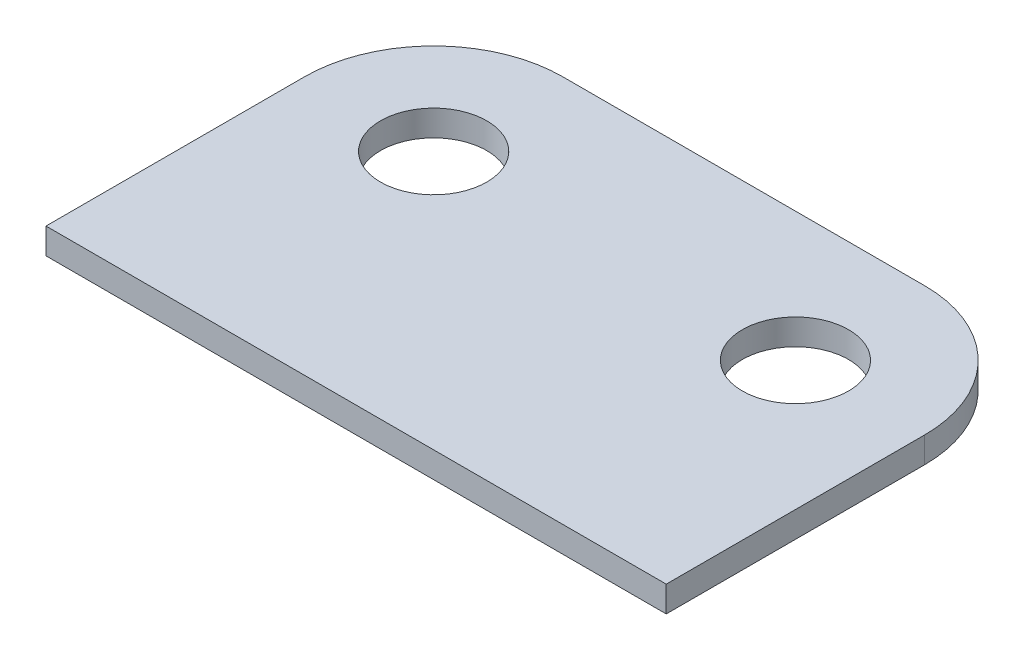
ISO-10303-21;
HEADER;
FILE_DESCRIPTION(('STEP AP214'),'2;1');
FILE_NAME('part.step','',(''),(''),'','','');
FILE_SCHEMA(('AUTOMOTIVE_DESIGN { 1 0 10303 214 1 1 1 1 }'));
ENDSEC;
DATA;
#1=APPLICATION_CONTEXT('core data for automotive mechanical design processes');
#2=APPLICATION_PROTOCOL_DEFINITION('international standard','automotive_design',2000,#1);
#3=PRODUCT_CONTEXT('',#1,'mechanical');
#4=PRODUCT('Part','Part','',(#3));
#5=PRODUCT_RELATED_PRODUCT_CATEGORY('part','',(#4));
#6=PRODUCT_DEFINITION_FORMATION('','',#4);
#7=PRODUCT_DEFINITION_CONTEXT('part definition',#1,'design');
#8=PRODUCT_DEFINITION('design','',#6,#7);
#9=PRODUCT_DEFINITION_SHAPE('','',#8);
#10=(LENGTH_UNIT() NAMED_UNIT(*) SI_UNIT(.MILLI.,.METRE.));
#11=(NAMED_UNIT(*) PLANE_ANGLE_UNIT() SI_UNIT($,.RADIAN.));
#12=(NAMED_UNIT(*) SI_UNIT($,.STERADIAN.) SOLID_ANGLE_UNIT());
#13=UNCERTAINTY_MEASURE_WITH_UNIT(LENGTH_MEASURE(1.E-05),#10,'distance_accuracy_value','');
#14=(GEOMETRIC_REPRESENTATION_CONTEXT(3) GLOBAL_UNCERTAINTY_ASSIGNED_CONTEXT((#13)) GLOBAL_UNIT_ASSIGNED_CONTEXT((#10,
#11,#12)) REPRESENTATION_CONTEXT('',''));
#15=CARTESIAN_POINT('',(0.,0.,0.));
#16=DIRECTION('',(0.,0.,1.));
#17=DIRECTION('',(1.,0.,0.));
#18=AXIS2_PLACEMENT_3D('',#15,#16,#17);
#19=CARTESIAN_POINT('',(11.1125,1.5875,-15.875));
#20=DIRECTION('',(0.,1.,0.));
#21=DIRECTION('',(0.,0.,1.));
#22=AXIS2_PLACEMENT_3D('',#19,#20,#21);
#23=PLANE('',#22);
#24=CARTESIAN_POINT('',(11.1125,1.5875,-15.875));
#25=DIRECTION('',(0.,1.,0.));
#26=DIRECTION('',(0.,0.,1.));
#27=AXIS2_PLACEMENT_3D('',#24,#25,#26);
#28=CIRCLE('',#27,3.2639);
#29=CARTESIAN_POINT('',(11.1125,1.5875,-12.6111));
#30=VERTEX_POINT('',#29);
#31=EDGE_CURVE('E127',#30,#30,#28,.T.);
#32=ORIENTED_EDGE('',*,*,#31,.F.);
#33=EDGE_LOOP('',(#32));
#34=FACE_BOUND('',#33,.T.);
#35=DIRECTION('',(0.,0.,-1.));
#36=VECTOR('',#35,1.);
#37=CARTESIAN_POINT('',(19.05,1.5875,0.));
#38=LINE('',#37,#36);
#39=CARTESIAN_POINT('',(19.05,1.5875,0.));
#40=VERTEX_POINT('',#39);
#41=CARTESIAN_POINT('',(19.05,1.5875,-15.875));
#42=VERTEX_POINT('',#41);
#43=EDGE_CURVE('E134',#40,#42,#38,.T.);
#44=ORIENTED_EDGE('',*,*,#43,.T.);
#45=CARTESIAN_POINT('',(11.1125,1.5875,-15.875));
#46=DIRECTION('',(0.,1.,0.));
#47=DIRECTION('',(0.,0.,1.));
#48=AXIS2_PLACEMENT_3D('',#45,#46,#47);
#49=CIRCLE('',#48,7.9375);
#50=CARTESIAN_POINT('',(11.1125,1.5875,-23.8125));
#51=VERTEX_POINT('',#50);
#52=EDGE_CURVE('E92',#42,#51,#49,.T.);
#53=ORIENTED_EDGE('',*,*,#52,.T.);
#54=DIRECTION('',(-1.,0.,0.));
#55=VECTOR('',#54,1.);
#56=CARTESIAN_POINT('',(-11.1125,1.5875,-23.8125));
#57=LINE('',#56,#55);
#58=CARTESIAN_POINT('',(-11.1125,1.5875,-23.8125));
#59=VERTEX_POINT('',#58);
#60=EDGE_CURVE('E105',#51,#59,#57,.T.);
#61=ORIENTED_EDGE('',*,*,#60,.T.);
#62=CARTESIAN_POINT('',(-11.1125,1.5875,-15.875));
#63=DIRECTION('',(0.,1.,0.));
#64=DIRECTION('',(0.,0.,1.));
#65=AXIS2_PLACEMENT_3D('',#62,#63,#64);
#66=CIRCLE('',#65,7.9375);
#67=CARTESIAN_POINT('',(-19.05,1.5875,-15.875));
#68=VERTEX_POINT('',#67);
#69=EDGE_CURVE('E99',#59,#68,#66,.T.);
#70=ORIENTED_EDGE('',*,*,#69,.T.);
#71=DIRECTION('',(0.,0.,1.));
#72=VECTOR('',#71,1.);
#73=CARTESIAN_POINT('',(-19.05,1.5875,-15.875));
#74=LINE('',#73,#72);
#75=CARTESIAN_POINT('',(-19.05,1.5875,0.));
#76=VERTEX_POINT('',#75);
#77=EDGE_CURVE('E103',#68,#76,#74,.T.);
#78=ORIENTED_EDGE('',*,*,#77,.T.);
#79=DIRECTION('',(1.,0.,0.));
#80=VECTOR('',#79,1.);
#81=CARTESIAN_POINT('',(-19.05,1.5875,0.));
#82=LINE('',#81,#80);
#83=EDGE_CURVE('E55',#76,#40,#82,.T.);
#84=ORIENTED_EDGE('',*,*,#83,.T.);
#85=EDGE_LOOP('',(#44,#53,#61,#70,#78,#84));
#86=FACE_BOUND('',#85,.T.);
#87=CARTESIAN_POINT('',(-11.1125,1.5875,-15.875));
#88=DIRECTION('',(0.,1.,0.));
#89=DIRECTION('',(0.,0.,1.));
#90=AXIS2_PLACEMENT_3D('',#87,#88,#89);
#91=CIRCLE('',#90,3.2639);
#92=CARTESIAN_POINT('',(-11.1125,1.5875,-12.6111));
#93=VERTEX_POINT('',#92);
#94=EDGE_CURVE('E176',#93,#93,#91,.T.);
#95=ORIENTED_EDGE('',*,*,#94,.F.);
#96=EDGE_LOOP('',(#95));
#97=FACE_BOUND('',#96,.T.);
#98=ADVANCED_FACE('F38',(#34,#86,#97),#23,.T.);
#99=CARTESIAN_POINT('',(11.1125,0.,-15.875));
#100=DIRECTION('',(0.,1.,0.));
#101=DIRECTION('',(0.,0.,1.));
#102=AXIS2_PLACEMENT_3D('',#99,#100,#101);
#103=PLANE('',#102);
#104=DIRECTION('',(0.,0.,-1.));
#105=VECTOR('',#104,1.);
#106=CARTESIAN_POINT('',(19.05,0.,0.));
#107=LINE('',#106,#105);
#108=CARTESIAN_POINT('',(19.05,0.,0.));
#109=VERTEX_POINT('',#108);
#110=CARTESIAN_POINT('',(19.05,0.,-15.875));
#111=VERTEX_POINT('',#110);
#112=EDGE_CURVE('E123',#109,#111,#107,.T.);
#113=ORIENTED_EDGE('',*,*,#112,.F.);
#114=DIRECTION('',(1.,0.,0.));
#115=VECTOR('',#114,1.);
#116=CARTESIAN_POINT('',(-19.05,0.,0.));
#117=LINE('',#116,#115);
#118=CARTESIAN_POINT('',(-19.05,0.,0.));
#119=VERTEX_POINT('',#118);
#120=EDGE_CURVE('E84',#119,#109,#117,.T.);
#121=ORIENTED_EDGE('',*,*,#120,.F.);
#122=DIRECTION('',(0.,0.,1.));
#123=VECTOR('',#122,1.);
#124=CARTESIAN_POINT('',(-19.05,0.,-15.875));
#125=LINE('',#124,#123);
#126=CARTESIAN_POINT('',(-19.05,0.,-15.875));
#127=VERTEX_POINT('',#126);
#128=EDGE_CURVE('E78',#127,#119,#125,.T.);
#129=ORIENTED_EDGE('',*,*,#128,.F.);
#130=CARTESIAN_POINT('',(-11.1125,0.,-15.875));
#131=DIRECTION('',(0.,1.,0.));
#132=DIRECTION('',(0.,0.,1.));
#133=AXIS2_PLACEMENT_3D('',#130,#131,#132);
#134=CIRCLE('',#133,7.9375);
#135=CARTESIAN_POINT('',(-11.1125,0.,-23.8125));
#136=VERTEX_POINT('',#135);
#137=EDGE_CURVE('E113',#136,#127,#134,.T.);
#138=ORIENTED_EDGE('',*,*,#137,.F.);
#139=DIRECTION('',(-1.,0.,0.));
#140=VECTOR('',#139,1.);
#141=CARTESIAN_POINT('',(-11.1125,0.,-23.8125));
#142=LINE('',#141,#140);
#143=CARTESIAN_POINT('',(11.1125,0.,-23.8125));
#144=VERTEX_POINT('',#143);
#145=EDGE_CURVE('E129',#144,#136,#142,.T.);
#146=ORIENTED_EDGE('',*,*,#145,.F.);
#147=CARTESIAN_POINT('',(11.1125,0.,-15.875));
#148=DIRECTION('',(0.,1.,0.));
#149=DIRECTION('',(0.,0.,1.));
#150=AXIS2_PLACEMENT_3D('',#147,#148,#149);
#151=CIRCLE('',#150,7.9375);
#152=EDGE_CURVE('E126',#111,#144,#151,.T.);
#153=ORIENTED_EDGE('',*,*,#152,.F.);
#154=EDGE_LOOP('',(#113,#121,#129,#138,#146,#153));
#155=FACE_BOUND('',#154,.T.);
#156=CARTESIAN_POINT('',(11.1125,0.,-15.875));
#157=DIRECTION('',(0.,1.,0.));
#158=DIRECTION('',(0.,0.,1.));
#159=AXIS2_PLACEMENT_3D('',#156,#157,#158);
#160=CIRCLE('',#159,3.2639);
#161=CARTESIAN_POINT('',(11.1125,0.,-12.6111));
#162=VERTEX_POINT('',#161);
#163=EDGE_CURVE('E182',#162,#162,#160,.T.);
#164=ORIENTED_EDGE('',*,*,#163,.T.);
#165=EDGE_LOOP('',(#164));
#166=FACE_BOUND('',#165,.T.);
#167=CARTESIAN_POINT('',(-11.1125,0.,-15.875));
#168=DIRECTION('',(0.,1.,0.));
#169=DIRECTION('',(0.,0.,1.));
#170=AXIS2_PLACEMENT_3D('',#167,#168,#169);
#171=CIRCLE('',#170,3.2639);
#172=CARTESIAN_POINT('',(-11.1125,0.,-12.6111));
#173=VERTEX_POINT('',#172);
#174=EDGE_CURVE('E179',#173,#173,#171,.T.);
#175=ORIENTED_EDGE('',*,*,#174,.T.);
#176=EDGE_LOOP('',(#175));
#177=FACE_BOUND('',#176,.T.);
#178=ADVANCED_FACE('F143',(#155,#166,#177),#103,.F.);
#179=CARTESIAN_POINT('',(19.05,1.5875,0.));
#180=DIRECTION('',(-1.,0.,0.));
#181=DIRECTION('',(0.,0.,1.));
#182=AXIS2_PLACEMENT_3D('',#179,#180,#181);
#183=PLANE('',#182);
#184=ORIENTED_EDGE('',*,*,#112,.T.);
#185=DIRECTION('',(0.,-1.,0.));
#186=VECTOR('',#185,1.);
#187=CARTESIAN_POINT('',(19.05,1.5875,-15.875));
#188=LINE('',#187,#186);
#189=EDGE_CURVE('E11',#42,#111,#188,.T.);
#190=ORIENTED_EDGE('',*,*,#189,.F.);
#191=ORIENTED_EDGE('',*,*,#43,.F.);
#192=DIRECTION('',(0.,-1.,0.));
#193=VECTOR('',#192,1.);
#194=CARTESIAN_POINT('',(19.05,1.5875,0.));
#195=LINE('',#194,#193);
#196=EDGE_CURVE('E119',#40,#109,#195,.T.);
#197=ORIENTED_EDGE('',*,*,#196,.T.);
#198=EDGE_LOOP('',(#184,#190,#191,#197));
#199=FACE_BOUND('',#198,.T.);
#200=ADVANCED_FACE('F40',(#199),#183,.F.);
#201=CARTESIAN_POINT('',(11.1125,1.5875,-15.875));
#202=DIRECTION('',(0.,-1.,0.));
#203=DIRECTION('',(0.,0.,-1.));
#204=AXIS2_PLACEMENT_3D('',#201,#202,#203);
#205=CYLINDRICAL_SURFACE('',#204,7.9375);
#206=ORIENTED_EDGE('',*,*,#152,.T.);
#207=DIRECTION('',(0.,-1.,0.));
#208=VECTOR('',#207,1.);
#209=CARTESIAN_POINT('',(11.1125,1.5875,-23.8125));
#210=LINE('',#209,#208);
#211=EDGE_CURVE('E47',#51,#144,#210,.T.);
#212=ORIENTED_EDGE('',*,*,#211,.F.);
#213=ORIENTED_EDGE('',*,*,#52,.F.);
#214=ORIENTED_EDGE('',*,*,#189,.T.);
#215=EDGE_LOOP('',(#206,#212,#213,#214));
#216=FACE_BOUND('',#215,.T.);
#217=ADVANCED_FACE('F225',(#216),#205,.T.);
#218=CARTESIAN_POINT('',(-11.1125,1.5875,-23.8125));
#219=DIRECTION('',(0.,0.,1.));
#220=DIRECTION('',(1.,0.,0.));
#221=AXIS2_PLACEMENT_3D('',#218,#219,#220);
#222=PLANE('',#221);
#223=ORIENTED_EDGE('',*,*,#145,.T.);
#224=DIRECTION('',(0.,-1.,0.));
#225=VECTOR('',#224,1.);
#226=CARTESIAN_POINT('',(-11.1125,1.5875,-23.8125));
#227=LINE('',#226,#225);
#228=EDGE_CURVE('E114',#59,#136,#227,.T.);
#229=ORIENTED_EDGE('',*,*,#228,.F.);
#230=ORIENTED_EDGE('',*,*,#60,.F.);
#231=ORIENTED_EDGE('',*,*,#211,.T.);
#232=EDGE_LOOP('',(#223,#229,#230,#231));
#233=FACE_BOUND('',#232,.T.);
#234=ADVANCED_FACE('F140',(#233),#222,.F.);
#235=CARTESIAN_POINT('',(-11.1125,1.5875,-15.875));
#236=DIRECTION('',(0.,-1.,0.));
#237=DIRECTION('',(0.,0.,-1.));
#238=AXIS2_PLACEMENT_3D('',#235,#236,#237);
#239=CYLINDRICAL_SURFACE('',#238,7.9375);
#240=ORIENTED_EDGE('',*,*,#137,.T.);
#241=DIRECTION('',(0.,-1.,0.));
#242=VECTOR('',#241,1.);
#243=CARTESIAN_POINT('',(-19.05,1.5875,-15.875));
#244=LINE('',#243,#242);
#245=EDGE_CURVE('E110',#68,#127,#244,.T.);
#246=ORIENTED_EDGE('',*,*,#245,.F.);
#247=ORIENTED_EDGE('',*,*,#69,.F.);
#248=ORIENTED_EDGE('',*,*,#228,.T.);
#249=EDGE_LOOP('',(#240,#246,#247,#248));
#250=FACE_BOUND('',#249,.T.);
#251=ADVANCED_FACE('F111',(#250),#239,.T.);
#252=CARTESIAN_POINT('',(-19.05,1.5875,-15.875));
#253=DIRECTION('',(1.,0.,0.));
#254=DIRECTION('',(0.,0.,-1.));
#255=AXIS2_PLACEMENT_3D('',#252,#253,#254);
#256=PLANE('',#255);
#257=ORIENTED_EDGE('',*,*,#128,.T.);
#258=DIRECTION('',(0.,-1.,0.));
#259=VECTOR('',#258,1.);
#260=CARTESIAN_POINT('',(-19.05,1.5875,0.));
#261=LINE('',#260,#259);
#262=EDGE_CURVE('E115',#76,#119,#261,.T.);
#263=ORIENTED_EDGE('',*,*,#262,.F.);
#264=ORIENTED_EDGE('',*,*,#77,.F.);
#265=ORIENTED_EDGE('',*,*,#245,.T.);
#266=EDGE_LOOP('',(#257,#263,#264,#265));
#267=FACE_BOUND('',#266,.T.);
#268=ADVANCED_FACE('F117',(#267),#256,.F.);
#269=CARTESIAN_POINT('',(-19.05,1.5875,0.));
#270=DIRECTION('',(0.,0.,-1.));
#271=DIRECTION('',(-1.,0.,0.));
#272=AXIS2_PLACEMENT_3D('',#269,#270,#271);
#273=PLANE('',#272);
#274=ORIENTED_EDGE('',*,*,#120,.T.);
#275=ORIENTED_EDGE('',*,*,#196,.F.);
#276=ORIENTED_EDGE('',*,*,#83,.F.);
#277=ORIENTED_EDGE('',*,*,#262,.T.);
#278=EDGE_LOOP('',(#274,#275,#276,#277));
#279=FACE_BOUND('',#278,.T.);
#280=ADVANCED_FACE('F148',(#279),#273,.F.);
#281=CARTESIAN_POINT('',(11.1125,1.5875,-15.875));
#282=DIRECTION('',(0.,-1.,0.));
#283=DIRECTION('',(0.,0.,-1.));
#284=AXIS2_PLACEMENT_3D('',#281,#282,#283);
#285=CYLINDRICAL_SURFACE('',#284,3.2639);
#286=ORIENTED_EDGE('',*,*,#31,.T.);
#287=EDGE_LOOP('',(#286));
#288=FACE_BOUND('',#287,.T.);
#289=ORIENTED_EDGE('',*,*,#163,.F.);
#290=EDGE_LOOP('',(#289));
#291=FACE_BOUND('',#290,.T.);
#292=ADVANCED_FACE('F150',(#288,#291),#285,.F.);
#293=CARTESIAN_POINT('',(-11.1125,1.5875,-15.875));
#294=DIRECTION('',(0.,-1.,0.));
#295=DIRECTION('',(0.,0.,-1.));
#296=AXIS2_PLACEMENT_3D('',#293,#294,#295);
#297=CYLINDRICAL_SURFACE('',#296,3.2639);
#298=ORIENTED_EDGE('',*,*,#94,.T.);
#299=EDGE_LOOP('',(#298));
#300=FACE_BOUND('',#299,.T.);
#301=ORIENTED_EDGE('',*,*,#174,.F.);
#302=EDGE_LOOP('',(#301));
#303=FACE_BOUND('',#302,.T.);
#304=ADVANCED_FACE('F156',(#300,#303),#297,.F.);
#305=CLOSED_SHELL('',(#98,#178,#200,#217,#234,#251,#268,#280,#292,#304));
#306=MANIFOLD_SOLID_BREP('B2',#305);
#307=ADVANCED_BREP_SHAPE_REPRESENTATION('',(#18,#306),#14);
#308=SHAPE_DEFINITION_REPRESENTATION(#9,#307);
ENDSEC;
END-ISO-10303-21;
